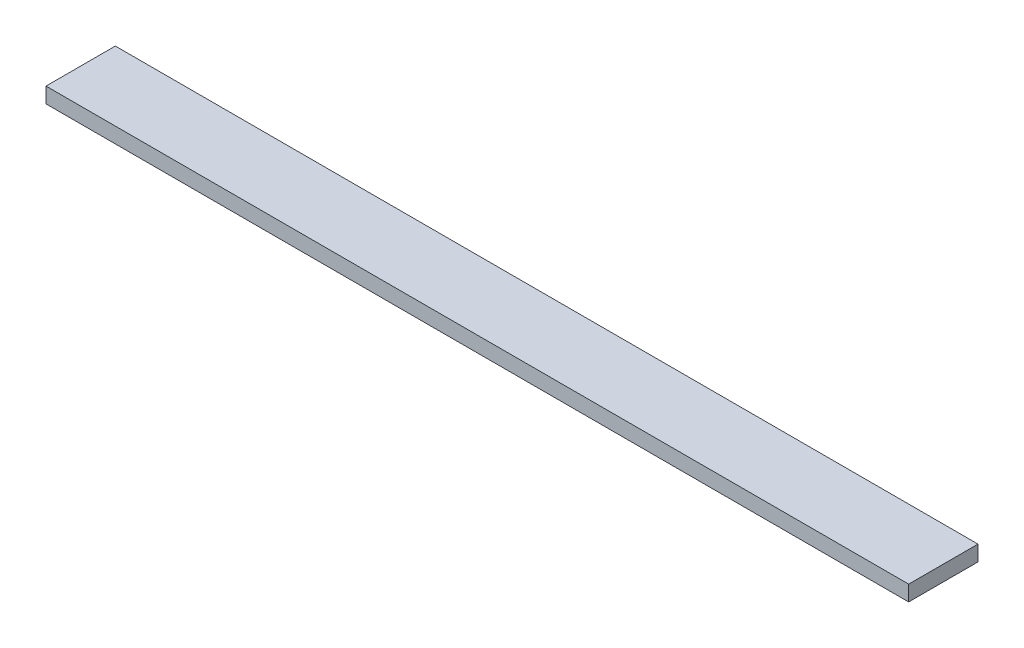
ISO-10303-21;
HEADER;
FILE_DESCRIPTION(('STEP AP214'),'2;1');
FILE_NAME('part.step','',(''),(''),'','','');
FILE_SCHEMA(('AUTOMOTIVE_DESIGN { 1 0 10303 214 1 1 1 1 }'));
ENDSEC;
DATA;
#1=APPLICATION_CONTEXT('core data for automotive mechanical design processes');
#2=APPLICATION_PROTOCOL_DEFINITION('international standard','automotive_design',2000,#1);
#3=PRODUCT_CONTEXT('',#1,'mechanical');
#4=PRODUCT('Part','Part','',(#3));
#5=PRODUCT_RELATED_PRODUCT_CATEGORY('part','',(#4));
#6=PRODUCT_DEFINITION_FORMATION('','',#4);
#7=PRODUCT_DEFINITION_CONTEXT('part definition',#1,'design');
#8=PRODUCT_DEFINITION('design','',#6,#7);
#9=PRODUCT_DEFINITION_SHAPE('','',#8);
#10=(LENGTH_UNIT() NAMED_UNIT(*) SI_UNIT(.MILLI.,.METRE.));
#11=(NAMED_UNIT(*) PLANE_ANGLE_UNIT() SI_UNIT($,.RADIAN.));
#12=(NAMED_UNIT(*) SI_UNIT($,.STERADIAN.) SOLID_ANGLE_UNIT());
#13=UNCERTAINTY_MEASURE_WITH_UNIT(LENGTH_MEASURE(1.E-05),#10,'distance_accuracy_value','');
#14=(GEOMETRIC_REPRESENTATION_CONTEXT(3) GLOBAL_UNCERTAINTY_ASSIGNED_CONTEXT((#13)) GLOBAL_UNIT_ASSIGNED_CONTEXT((#10,
#11,#12)) REPRESENTATION_CONTEXT('',''));
#15=CARTESIAN_POINT('',(0.,0.,0.));
#16=DIRECTION('',(0.,0.,1.));
#17=DIRECTION('',(1.,0.,0.));
#18=AXIS2_PLACEMENT_3D('',#15,#16,#17);
#19=CARTESIAN_POINT('',(0.,12.7,0.));
#20=DIRECTION('',(1.,0.,0.));
#21=DIRECTION('',(0.,0.,-1.));
#22=AXIS2_PLACEMENT_3D('',#19,#20,#21);
#23=PLANE('',#22);
#24=DIRECTION('',(0.,0.,1.));
#25=VECTOR('',#24,1.);
#26=CARTESIAN_POINT('',(0.,0.,0.));
#27=LINE('',#26,#25);
#28=CARTESIAN_POINT('',(0.,0.,-56.98));
#29=VERTEX_POINT('',#28);
#30=CARTESIAN_POINT('',(0.,0.,0.));
#31=VERTEX_POINT('',#30);
#32=EDGE_CURVE('E113',#29,#31,#27,.T.);
#33=ORIENTED_EDGE('',*,*,#32,.T.);
#34=DIRECTION('',(0.,-1.,0.));
#35=VECTOR('',#34,1.);
#36=CARTESIAN_POINT('',(0.,12.7,0.));
#37=LINE('',#36,#35);
#38=CARTESIAN_POINT('',(0.,12.7,0.));
#39=VERTEX_POINT('',#38);
#40=EDGE_CURVE('E11',#39,#31,#37,.T.);
#41=ORIENTED_EDGE('',*,*,#40,.F.);
#42=DIRECTION('',(0.,0.,1.));
#43=VECTOR('',#42,1.);
#44=CARTESIAN_POINT('',(0.,12.7,0.));
#45=LINE('',#44,#43);
#46=CARTESIAN_POINT('',(0.,12.7,-56.98));
#47=VERTEX_POINT('',#46);
#48=EDGE_CURVE('E97',#47,#39,#45,.T.);
#49=ORIENTED_EDGE('',*,*,#48,.F.);
#50=DIRECTION('',(0.,-1.,0.));
#51=VECTOR('',#50,1.);
#52=CARTESIAN_POINT('',(0.,12.7,-56.98));
#53=LINE('',#52,#51);
#54=EDGE_CURVE('E109',#47,#29,#53,.T.);
#55=ORIENTED_EDGE('',*,*,#54,.T.);
#56=EDGE_LOOP('',(#33,#41,#49,#55));
#57=FACE_BOUND('',#56,.T.);
#58=ADVANCED_FACE('F45',(#57),#23,.F.);
#59=CARTESIAN_POINT('',(0.,12.7,0.));
#60=DIRECTION('',(0.,0.,-1.));
#61=DIRECTION('',(-1.,0.,0.));
#62=AXIS2_PLACEMENT_3D('',#59,#60,#61);
#63=PLANE('',#62);
#64=DIRECTION('',(1.,0.,0.));
#65=VECTOR('',#64,1.);
#66=CARTESIAN_POINT('',(0.,0.,0.));
#67=LINE('',#66,#65);
#68=CARTESIAN_POINT('',(709.,0.,0.));
#69=VERTEX_POINT('',#68);
#70=EDGE_CURVE('E102',#31,#69,#67,.T.);
#71=ORIENTED_EDGE('',*,*,#70,.T.);
#72=DIRECTION('',(0.,-1.,0.));
#73=VECTOR('',#72,1.);
#74=CARTESIAN_POINT('',(709.,12.7,0.));
#75=LINE('',#74,#73);
#76=CARTESIAN_POINT('',(709.,12.7,0.));
#77=VERTEX_POINT('',#76);
#78=EDGE_CURVE('E54',#77,#69,#75,.T.);
#79=ORIENTED_EDGE('',*,*,#78,.F.);
#80=DIRECTION('',(1.,0.,0.));
#81=VECTOR('',#80,1.);
#82=CARTESIAN_POINT('',(0.,12.7,0.));
#83=LINE('',#82,#81);
#84=EDGE_CURVE('E92',#39,#77,#83,.T.);
#85=ORIENTED_EDGE('',*,*,#84,.F.);
#86=ORIENTED_EDGE('',*,*,#40,.T.);
#87=EDGE_LOOP('',(#71,#79,#85,#86));
#88=FACE_BOUND('',#87,.T.);
#89=ADVANCED_FACE('F101',(#88),#63,.F.);
#90=CARTESIAN_POINT('',(709.,12.7,0.));
#91=DIRECTION('',(-1.,0.,0.));
#92=DIRECTION('',(0.,0.,1.));
#93=AXIS2_PLACEMENT_3D('',#90,#91,#92);
#94=PLANE('',#93);
#95=DIRECTION('',(0.,0.,-1.));
#96=VECTOR('',#95,1.);
#97=CARTESIAN_POINT('',(709.,0.,0.));
#98=LINE('',#97,#96);
#99=CARTESIAN_POINT('',(709.,0.,-56.98));
#100=VERTEX_POINT('',#99);
#101=EDGE_CURVE('E79',#69,#100,#98,.T.);
#102=ORIENTED_EDGE('',*,*,#101,.T.);
#103=DIRECTION('',(0.,-1.,0.));
#104=VECTOR('',#103,1.);
#105=CARTESIAN_POINT('',(709.,12.7,-56.98));
#106=LINE('',#105,#104);
#107=CARTESIAN_POINT('',(709.,12.7,-56.98));
#108=VERTEX_POINT('',#107);
#109=EDGE_CURVE('E104',#108,#100,#106,.T.);
#110=ORIENTED_EDGE('',*,*,#109,.F.);
#111=DIRECTION('',(0.,0.,-1.));
#112=VECTOR('',#111,1.);
#113=CARTESIAN_POINT('',(709.,12.7,0.));
#114=LINE('',#113,#112);
#115=EDGE_CURVE('E95',#77,#108,#114,.T.);
#116=ORIENTED_EDGE('',*,*,#115,.F.);
#117=ORIENTED_EDGE('',*,*,#78,.T.);
#118=EDGE_LOOP('',(#102,#110,#116,#117));
#119=FACE_BOUND('',#118,.T.);
#120=ADVANCED_FACE('F105',(#119),#94,.F.);
#121=CARTESIAN_POINT('',(0.,12.7,-56.98));
#122=DIRECTION('',(0.,0.,1.));
#123=DIRECTION('',(1.,0.,0.));
#124=AXIS2_PLACEMENT_3D('',#121,#122,#123);
#125=PLANE('',#124);
#126=CARTESIAN_POINT('',(699.,6.35,-56.98));
#127=DIRECTION('',(0.,0.,-1.));
#128=DIRECTION('',(-1.,0.,0.));
#129=AXIS2_PLACEMENT_3D('',#126,#127,#128);
#130=CIRCLE('',#129,2.01949999999992);
#131=CARTESIAN_POINT('',(696.9805,6.35,-56.98));
#132=VERTEX_POINT('',#131);
#133=EDGE_CURVE('E146',#132,#132,#130,.T.);
#134=ORIENTED_EDGE('',*,*,#133,.F.);
#135=EDGE_LOOP('',(#134));
#136=FACE_BOUND('',#135,.T.);
#137=CARTESIAN_POINT('',(10.,6.35,-56.98));
#138=DIRECTION('',(0.,0.,-1.));
#139=DIRECTION('',(-1.,0.,0.));
#140=AXIS2_PLACEMENT_3D('',#137,#138,#139);
#141=CIRCLE('',#140,2.0195);
#142=CARTESIAN_POINT('',(7.98050000000001,6.35,-56.98));
#143=VERTEX_POINT('',#142);
#144=EDGE_CURVE('E138',#143,#143,#141,.T.);
#145=ORIENTED_EDGE('',*,*,#144,.F.);
#146=EDGE_LOOP('',(#145));
#147=FACE_BOUND('',#146,.T.);
#148=CARTESIAN_POINT('',(354.5,6.35,-56.98));
#149=DIRECTION('',(0.,0.,-1.));
#150=DIRECTION('',(-1.,0.,0.));
#151=AXIS2_PLACEMENT_3D('',#148,#149,#150);
#152=CIRCLE('',#151,2.01950000000003);
#153=CARTESIAN_POINT('',(352.4805,6.35,-56.98));
#154=VERTEX_POINT('',#153);
#155=EDGE_CURVE('E134',#154,#154,#152,.T.);
#156=ORIENTED_EDGE('',*,*,#155,.F.);
#157=EDGE_LOOP('',(#156));
#158=FACE_BOUND('',#157,.T.);
#159=DIRECTION('',(-1.,0.,0.));
#160=VECTOR('',#159,1.);
#161=CARTESIAN_POINT('',(0.,0.,-56.98));
#162=LINE('',#161,#160);
#163=EDGE_CURVE('E85',#100,#29,#162,.T.);
#164=ORIENTED_EDGE('',*,*,#163,.T.);
#165=ORIENTED_EDGE('',*,*,#54,.F.);
#166=DIRECTION('',(-1.,0.,0.));
#167=VECTOR('',#166,1.);
#168=CARTESIAN_POINT('',(0.,12.7,-56.98));
#169=LINE('',#168,#167);
#170=EDGE_CURVE('E62',#108,#47,#169,.T.);
#171=ORIENTED_EDGE('',*,*,#170,.F.);
#172=ORIENTED_EDGE('',*,*,#109,.T.);
#173=EDGE_LOOP('',(#164,#165,#171,#172));
#174=FACE_BOUND('',#173,.T.);
#175=ADVANCED_FACE('F127',(#136,#147,#158,#174),#125,.F.);
#176=CARTESIAN_POINT('',(0.,12.7,0.));
#177=DIRECTION('',(0.,-1.,0.));
#178=DIRECTION('',(0.,0.,-1.));
#179=AXIS2_PLACEMENT_3D('',#176,#177,#178);
#180=PLANE('',#179);
#181=ORIENTED_EDGE('',*,*,#48,.T.);
#182=ORIENTED_EDGE('',*,*,#84,.T.);
#183=ORIENTED_EDGE('',*,*,#115,.T.);
#184=ORIENTED_EDGE('',*,*,#170,.T.);
#185=EDGE_LOOP('',(#181,#182,#183,#184));
#186=FACE_BOUND('',#185,.T.);
#187=ADVANCED_FACE('F93',(#186),#180,.F.);
#188=CARTESIAN_POINT('',(0.,0.,0.));
#189=DIRECTION('',(0.,-1.,0.));
#190=DIRECTION('',(0.,0.,-1.));
#191=AXIS2_PLACEMENT_3D('',#188,#189,#190);
#192=PLANE('',#191);
#193=ORIENTED_EDGE('',*,*,#32,.F.);
#194=ORIENTED_EDGE('',*,*,#163,.F.);
#195=ORIENTED_EDGE('',*,*,#101,.F.);
#196=ORIENTED_EDGE('',*,*,#70,.F.);
#197=EDGE_LOOP('',(#193,#194,#195,#196));
#198=FACE_BOUND('',#197,.T.);
#199=ADVANCED_FACE('F130',(#198),#192,.T.);
#200=CARTESIAN_POINT('',(354.5,6.35,-44.28));
#201=DIRECTION('',(0.,0.,-1.));
#202=DIRECTION('',(-1.,0.,0.));
#203=AXIS2_PLACEMENT_3D('',#200,#201,#202);
#204=CYLINDRICAL_SURFACE('',#203,2.01950000000003);
#205=CARTESIAN_POINT('',(354.5,6.35,-44.28));
#206=DIRECTION('',(0.,0.,-1.));
#207=DIRECTION('',(-1.,0.,0.));
#208=AXIS2_PLACEMENT_3D('',#205,#206,#207);
#209=CIRCLE('',#208,2.01950000000003);
#210=CARTESIAN_POINT('',(352.4805,6.35,-44.28));
#211=VERTEX_POINT('',#210);
#212=EDGE_CURVE('E117',#211,#211,#209,.T.);
#213=ORIENTED_EDGE('',*,*,#212,.F.);
#214=EDGE_LOOP('',(#213));
#215=FACE_BOUND('',#214,.T.);
#216=ORIENTED_EDGE('',*,*,#155,.T.);
#217=EDGE_LOOP('',(#216));
#218=FACE_BOUND('',#217,.T.);
#219=ADVANCED_FACE('F166',(#215,#218),#204,.F.);
#220=CARTESIAN_POINT('',(354.5,6.35,-44.28));
#221=DIRECTION('',(0.,0.,-1.));
#222=DIRECTION('',(-1.,0.,0.));
#223=AXIS2_PLACEMENT_3D('',#220,#221,#222);
#224=PLANE('',#223);
#225=ORIENTED_EDGE('',*,*,#212,.T.);
#226=EDGE_LOOP('',(#225));
#227=FACE_BOUND('',#226,.T.);
#228=ADVANCED_FACE('F168',(#227),#224,.T.);
#229=CARTESIAN_POINT('',(10.,6.35,-44.28));
#230=DIRECTION('',(0.,0.,-1.));
#231=DIRECTION('',(-1.,0.,0.));
#232=AXIS2_PLACEMENT_3D('',#229,#230,#231);
#233=CYLINDRICAL_SURFACE('',#232,2.0195);
#234=CARTESIAN_POINT('',(10.,6.35,-44.28));
#235=DIRECTION('',(0.,0.,-1.));
#236=DIRECTION('',(-1.,0.,0.));
#237=AXIS2_PLACEMENT_3D('',#234,#235,#236);
#238=CIRCLE('',#237,2.0195);
#239=CARTESIAN_POINT('',(7.98050000000001,6.35,-44.28));
#240=VERTEX_POINT('',#239);
#241=EDGE_CURVE('E150',#240,#240,#238,.T.);
#242=ORIENTED_EDGE('',*,*,#241,.F.);
#243=EDGE_LOOP('',(#242));
#244=FACE_BOUND('',#243,.T.);
#245=ORIENTED_EDGE('',*,*,#144,.T.);
#246=EDGE_LOOP('',(#245));
#247=FACE_BOUND('',#246,.T.);
#248=ADVANCED_FACE('F158',(#244,#247),#233,.F.);
#249=CARTESIAN_POINT('',(10.,6.35,-44.28));
#250=DIRECTION('',(0.,0.,-1.));
#251=DIRECTION('',(-1.,0.,0.));
#252=AXIS2_PLACEMENT_3D('',#249,#250,#251);
#253=PLANE('',#252);
#254=ORIENTED_EDGE('',*,*,#241,.T.);
#255=EDGE_LOOP('',(#254));
#256=FACE_BOUND('',#255,.T.);
#257=ADVANCED_FACE('F235',(#256),#253,.T.);
#258=CARTESIAN_POINT('',(699.,6.35,-44.28));
#259=DIRECTION('',(0.,0.,-1.));
#260=DIRECTION('',(-1.,0.,0.));
#261=AXIS2_PLACEMENT_3D('',#258,#259,#260);
#262=CYLINDRICAL_SURFACE('',#261,2.01949999999992);
#263=CARTESIAN_POINT('',(699.,6.35,-44.28));
#264=DIRECTION('',(0.,0.,-1.));
#265=DIRECTION('',(-1.,0.,0.));
#266=AXIS2_PLACEMENT_3D('',#263,#264,#265);
#267=CIRCLE('',#266,2.01949999999992);
#268=CARTESIAN_POINT('',(696.9805,6.35,-44.28));
#269=VERTEX_POINT('',#268);
#270=EDGE_CURVE('E142',#269,#269,#267,.T.);
#271=ORIENTED_EDGE('',*,*,#270,.F.);
#272=EDGE_LOOP('',(#271));
#273=FACE_BOUND('',#272,.T.);
#274=ORIENTED_EDGE('',*,*,#133,.T.);
#275=EDGE_LOOP('',(#274));
#276=FACE_BOUND('',#275,.T.);
#277=ADVANCED_FACE('F244',(#273,#276),#262,.F.);
#278=CARTESIAN_POINT('',(699.,6.35,-44.28));
#279=DIRECTION('',(0.,0.,-1.));
#280=DIRECTION('',(-1.,0.,0.));
#281=AXIS2_PLACEMENT_3D('',#278,#279,#280);
#282=PLANE('',#281);
#283=ORIENTED_EDGE('',*,*,#270,.T.);
#284=EDGE_LOOP('',(#283));
#285=FACE_BOUND('',#284,.T.);
#286=ADVANCED_FACE('F253',(#285),#282,.T.);
#287=CLOSED_SHELL('',(#58,#89,#120,#175,#187,#199,#219,#228,#248,#257,#277,#286));
#288=MANIFOLD_SOLID_BREP('B2',#287);
#289=ADVANCED_BREP_SHAPE_REPRESENTATION('',(#18,#288),#14);
#290=SHAPE_DEFINITION_REPRESENTATION(#9,#289);
ENDSEC;
END-ISO-10303-21;
